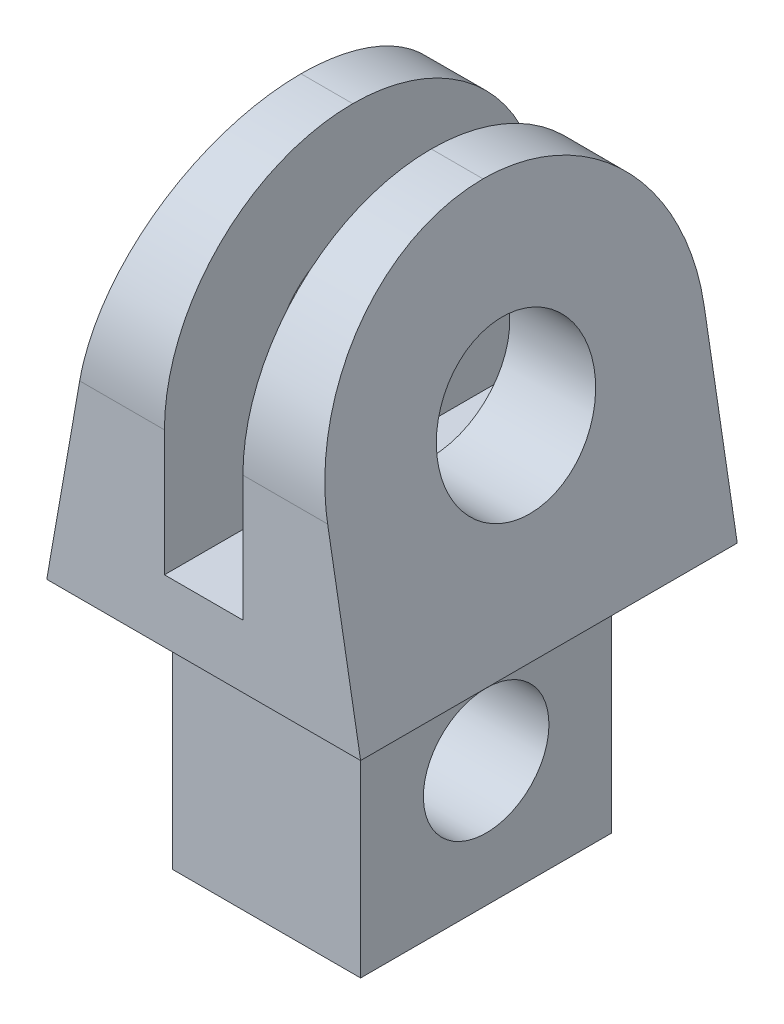
ISO-10303-21;
HEADER;
FILE_DESCRIPTION(('STEP AP214'),'2;1');
FILE_NAME('part.step','',(''),(''),'','','');
FILE_SCHEMA(('AUTOMOTIVE_DESIGN { 1 0 10303 214 1 1 1 1 }'));
ENDSEC;
DATA;
#1=APPLICATION_CONTEXT('core data for automotive mechanical design processes');
#2=APPLICATION_PROTOCOL_DEFINITION('international standard','automotive_design',2000,#1);
#3=PRODUCT_CONTEXT('',#1,'mechanical');
#4=PRODUCT('Part','Part','',(#3));
#5=PRODUCT_RELATED_PRODUCT_CATEGORY('part','',(#4));
#6=PRODUCT_DEFINITION_FORMATION('','',#4);
#7=PRODUCT_DEFINITION_CONTEXT('part definition',#1,'design');
#8=PRODUCT_DEFINITION('design','',#6,#7);
#9=PRODUCT_DEFINITION_SHAPE('','',#8);
#10=(LENGTH_UNIT() NAMED_UNIT(*) SI_UNIT(.MILLI.,.METRE.));
#11=(NAMED_UNIT(*) PLANE_ANGLE_UNIT() SI_UNIT($,.RADIAN.));
#12=(NAMED_UNIT(*) SI_UNIT($,.STERADIAN.) SOLID_ANGLE_UNIT());
#13=UNCERTAINTY_MEASURE_WITH_UNIT(LENGTH_MEASURE(1.E-05),#10,'distance_accuracy_value','');
#14=(GEOMETRIC_REPRESENTATION_CONTEXT(3) GLOBAL_UNCERTAINTY_ASSIGNED_CONTEXT((#13)) GLOBAL_UNIT_ASSIGNED_CONTEXT((#10,
#11,#12)) REPRESENTATION_CONTEXT('',''));
#15=CARTESIAN_POINT('',(0.,0.,0.));
#16=DIRECTION('',(0.,0.,1.));
#17=DIRECTION('',(1.,0.,0.));
#18=AXIS2_PLACEMENT_3D('',#15,#16,#17);
#19=CARTESIAN_POINT('',(-30.,0.,40.));
#20=DIRECTION('',(1.,0.,0.));
#21=DIRECTION('',(0.,1.,0.));
#22=AXIS2_PLACEMENT_3D('',#19,#20,#21);
#23=PLANE('',#22);
#24=CARTESIAN_POINT('',(-30.,-60.,0.));
#25=DIRECTION('',(1.,0.,0.));
#26=DIRECTION('',(0.,1.,0.));
#27=AXIS2_PLACEMENT_3D('',#24,#25,#26);
#28=CIRCLE('',#27,20.);
#29=CARTESIAN_POINT('',(-30.,-40.,0.));
#30=VERTEX_POINT('',#29);
#31=EDGE_CURVE('E255',#30,#30,#28,.T.);
#32=ORIENTED_EDGE('',*,*,#31,.T.);
#33=EDGE_LOOP('',(#32));
#34=FACE_BOUND('',#33,.T.);
#35=DIRECTION('',(0.,-1.,0.));
#36=VECTOR('',#35,1.);
#37=CARTESIAN_POINT('',(-30.,0.,-40.));
#38=LINE('',#37,#36);
#39=CARTESIAN_POINT('',(-30.,-20.,-40.));
#40=VERTEX_POINT('',#39);
#41=CARTESIAN_POINT('',(-30.,-100.,-40.));
#42=VERTEX_POINT('',#41);
#43=EDGE_CURVE('E149',#40,#42,#38,.T.);
#44=ORIENTED_EDGE('',*,*,#43,.T.);
#45=DIRECTION('',(0.,0.,-1.));
#46=VECTOR('',#45,1.);
#47=CARTESIAN_POINT('',(-30.,-100.,40.));
#48=LINE('',#47,#46);
#49=CARTESIAN_POINT('',(-30.,-100.,40.));
#50=VERTEX_POINT('',#49);
#51=EDGE_CURVE('E219',#50,#42,#48,.T.);
#52=ORIENTED_EDGE('',*,*,#51,.F.);
#53=DIRECTION('',(0.,-1.,0.));
#54=VECTOR('',#53,1.);
#55=CARTESIAN_POINT('',(-30.,0.,40.));
#56=LINE('',#55,#54);
#57=CARTESIAN_POINT('',(-30.,-20.,40.));
#58=VERTEX_POINT('',#57);
#59=EDGE_CURVE('E191',#58,#50,#56,.T.);
#60=ORIENTED_EDGE('',*,*,#59,.F.);
#61=DIRECTION('',(0.,0.,-1.));
#62=VECTOR('',#61,1.);
#63=CARTESIAN_POINT('',(-30.,-20.,40.));
#64=LINE('',#63,#62);
#65=EDGE_CURVE('E203',#58,#40,#64,.T.);
#66=ORIENTED_EDGE('',*,*,#65,.T.);
#67=EDGE_LOOP('',(#44,#52,#60,#66));
#68=FACE_BOUND('',#67,.T.);
#69=ADVANCED_FACE('F39',(#34,#68),#23,.F.);
#70=CARTESIAN_POINT('',(0.,-100.,40.));
#71=DIRECTION('',(0.,1.,0.));
#72=DIRECTION('',(0.,0.,1.));
#73=AXIS2_PLACEMENT_3D('',#70,#71,#72);
#74=PLANE('',#73);
#75=DIRECTION('',(1.,0.,0.));
#76=VECTOR('',#75,1.);
#77=CARTESIAN_POINT('',(0.,-100.,-40.));
#78=LINE('',#77,#76);
#79=CARTESIAN_POINT('',(30.,-100.,-40.));
#80=VERTEX_POINT('',#79);
#81=EDGE_CURVE('E206',#42,#80,#78,.T.);
#82=ORIENTED_EDGE('',*,*,#81,.T.);
#83=DIRECTION('',(0.,0.,-1.));
#84=VECTOR('',#83,1.);
#85=CARTESIAN_POINT('',(30.,-100.,40.));
#86=LINE('',#85,#84);
#87=CARTESIAN_POINT('',(30.,-100.,40.));
#88=VERTEX_POINT('',#87);
#89=EDGE_CURVE('E217',#88,#80,#86,.T.);
#90=ORIENTED_EDGE('',*,*,#89,.F.);
#91=DIRECTION('',(1.,0.,0.));
#92=VECTOR('',#91,1.);
#93=CARTESIAN_POINT('',(0.,-100.,40.));
#94=LINE('',#93,#92);
#95=EDGE_CURVE('E194',#50,#88,#94,.T.);
#96=ORIENTED_EDGE('',*,*,#95,.F.);
#97=ORIENTED_EDGE('',*,*,#51,.T.);
#98=EDGE_LOOP('',(#82,#90,#96,#97));
#99=FACE_BOUND('',#98,.T.);
#100=ADVANCED_FACE('F311',(#99),#74,.F.);
#101=CARTESIAN_POINT('',(30.,0.,40.));
#102=DIRECTION('',(1.,0.,0.));
#103=DIRECTION('',(0.,1.,0.));
#104=AXIS2_PLACEMENT_3D('',#101,#102,#103);
#105=PLANE('',#104);
#106=CARTESIAN_POINT('',(30.,-60.,0.));
#107=DIRECTION('',(1.,0.,0.));
#108=DIRECTION('',(0.,1.,0.));
#109=AXIS2_PLACEMENT_3D('',#106,#107,#108);
#110=CIRCLE('',#109,20.);
#111=CARTESIAN_POINT('',(30.,-40.,0.));
#112=VERTEX_POINT('',#111);
#113=EDGE_CURVE('E43',#112,#112,#110,.T.);
#114=ORIENTED_EDGE('',*,*,#113,.F.);
#115=EDGE_LOOP('',(#114));
#116=FACE_BOUND('',#115,.T.);
#117=DIRECTION('',(0.,-1.,0.));
#118=VECTOR('',#117,1.);
#119=CARTESIAN_POINT('',(30.,0.,-40.));
#120=LINE('',#119,#118);
#121=CARTESIAN_POINT('',(30.,-20.,-40.));
#122=VERTEX_POINT('',#121);
#123=EDGE_CURVE('E209',#122,#80,#120,.T.);
#124=ORIENTED_EDGE('',*,*,#123,.F.);
#125=DIRECTION('',(0.,0.,-1.));
#126=VECTOR('',#125,1.);
#127=CARTESIAN_POINT('',(30.,-20.,40.));
#128=LINE('',#127,#126);
#129=CARTESIAN_POINT('',(30.,-20.,40.));
#130=VERTEX_POINT('',#129);
#131=EDGE_CURVE('E214',#130,#122,#128,.T.);
#132=ORIENTED_EDGE('',*,*,#131,.F.);
#133=DIRECTION('',(0.,-1.,0.));
#134=VECTOR('',#133,1.);
#135=CARTESIAN_POINT('',(30.,0.,40.));
#136=LINE('',#135,#134);
#137=EDGE_CURVE('E197',#130,#88,#136,.T.);
#138=ORIENTED_EDGE('',*,*,#137,.T.);
#139=ORIENTED_EDGE('',*,*,#89,.T.);
#140=EDGE_LOOP('',(#124,#132,#138,#139));
#141=FACE_BOUND('',#140,.T.);
#142=ADVANCED_FACE('F317',(#116,#141),#105,.T.);
#143=CARTESIAN_POINT('',(0.,0.,40.));
#144=DIRECTION('',(0.,0.,1.));
#145=DIRECTION('',(1.,0.,0.));
#146=AXIS2_PLACEMENT_3D('',#143,#144,#145);
#147=PLANE('',#146);
#148=ORIENTED_EDGE('',*,*,#59,.T.);
#149=ORIENTED_EDGE('',*,*,#95,.T.);
#150=ORIENTED_EDGE('',*,*,#137,.F.);
#151=DIRECTION('',(1.,0.,0.));
#152=VECTOR('',#151,1.);
#153=CARTESIAN_POINT('',(0.,-20.,40.));
#154=LINE('',#153,#152);
#155=EDGE_CURVE('E200',#58,#130,#154,.T.);
#156=ORIENTED_EDGE('',*,*,#155,.F.);
#157=EDGE_LOOP('',(#148,#149,#150,#156));
#158=FACE_BOUND('',#157,.T.);
#159=ADVANCED_FACE('F323',(#158),#147,.T.);
#160=CARTESIAN_POINT('',(0.,0.,-40.));
#161=DIRECTION('',(0.,0.,1.));
#162=DIRECTION('',(1.,0.,0.));
#163=AXIS2_PLACEMENT_3D('',#160,#161,#162);
#164=PLANE('',#163);
#165=ORIENTED_EDGE('',*,*,#43,.F.);
#166=DIRECTION('',(1.,0.,0.));
#167=VECTOR('',#166,1.);
#168=CARTESIAN_POINT('',(0.,-20.,-40.));
#169=LINE('',#168,#167);
#170=EDGE_CURVE('E195',#40,#122,#169,.T.);
#171=ORIENTED_EDGE('',*,*,#170,.T.);
#172=ORIENTED_EDGE('',*,*,#123,.T.);
#173=ORIENTED_EDGE('',*,*,#81,.F.);
#174=EDGE_LOOP('',(#165,#171,#172,#173));
#175=FACE_BOUND('',#174,.T.);
#176=ADVANCED_FACE('F325',(#175),#164,.F.);
#177=CARTESIAN_POINT('',(45.1182534869618,7.89569436021831,60.));
#178=DIRECTION('',(0.985030467155704,0.172380331752248,0.));
#179=DIRECTION('',(-0.172380331752248,0.985030467155704,0.));
#180=AXIS2_PLACEMENT_3D('',#177,#178,#179);
#181=PLANE('',#180);
#182=CARTESIAN_POINT('',(39.5,40.,0.));
#183=DIRECTION('',(0.985030467155704,0.172380331752248,0.));
#184=DIRECTION('',(0.172380331752248,-0.985030467155704,0.));
#185=AXIS2_PLACEMENT_3D('',#182,#183,#184);
#186=ELLIPSE('',#185,25.3799256303087,25.);
#187=CARTESIAN_POINT('',(43.875,15.,0.));
#188=VERTEX_POINT('',#187);
#189=EDGE_CURVE('E173',#188,#188,#186,.T.);
#190=ORIENTED_EDGE('',*,*,#189,.F.);
#191=EDGE_LOOP('',(#190));
#192=FACE_BOUND('',#191,.T.);
#193=DIRECTION('',(0.172380331752248,-0.985030467155704,0.));
#194=VECTOR('',#193,1.);
#195=CARTESIAN_POINT('',(45.1182534869618,7.89569436021831,-60.));
#196=LINE('',#195,#194);
#197=CARTESIAN_POINT('',(39.5,40.,-60.));
#198=VERTEX_POINT('',#197);
#199=CARTESIAN_POINT('',(50.,-20.,-60.));
#200=VERTEX_POINT('',#199);
#201=EDGE_CURVE('E171',#198,#200,#196,.T.);
#202=ORIENTED_EDGE('',*,*,#201,.F.);
#203=CARTESIAN_POINT('',(39.5,40.,0.));
#204=DIRECTION('',(0.985030467155704,0.172380331752248,0.));
#205=DIRECTION('',(-0.172380331752248,0.985030467155704,0.));
#206=AXIS2_PLACEMENT_3D('',#203,#204,#205);
#207=ELLIPSE('',#206,60.9118215127409,60.);
#208=CARTESIAN_POINT('',(29.,100.,0.));
#209=VERTEX_POINT('',#208);
#210=EDGE_CURVE('E243',#198,#209,#207,.T.);
#211=ORIENTED_EDGE('',*,*,#210,.T.);
#212=CARTESIAN_POINT('',(39.5,40.,0.));
#213=DIRECTION('',(0.985030467155704,0.172380331752248,0.));
#214=DIRECTION('',(0.172380331752248,-0.985030467155704,0.));
#215=AXIS2_PLACEMENT_3D('',#212,#213,#214);
#216=ELLIPSE('',#215,60.9118215127409,60.);
#217=CARTESIAN_POINT('',(39.5,40.,60.));
#218=VERTEX_POINT('',#217);
#219=EDGE_CURVE('E241',#209,#218,#216,.T.);
#220=ORIENTED_EDGE('',*,*,#219,.T.);
#221=DIRECTION('',(0.172380331752248,-0.985030467155704,0.));
#222=VECTOR('',#221,1.);
#223=CARTESIAN_POINT('',(45.1182534869618,7.89569436021831,60.));
#224=LINE('',#223,#222);
#225=CARTESIAN_POINT('',(50.,-20.,60.));
#226=VERTEX_POINT('',#225);
#227=EDGE_CURVE('E156',#218,#226,#224,.T.);
#228=ORIENTED_EDGE('',*,*,#227,.T.);
#229=DIRECTION('',(0.,0.,-1.));
#230=VECTOR('',#229,1.);
#231=CARTESIAN_POINT('',(50.,-20.,60.));
#232=LINE('',#231,#230);
#233=EDGE_CURVE('E170',#226,#200,#232,.T.);
#234=ORIENTED_EDGE('',*,*,#233,.T.);
#235=EDGE_LOOP('',(#202,#211,#220,#228,#234));
#236=FACE_BOUND('',#235,.T.);
#237=ADVANCED_FACE('F271',(#192,#236),#181,.T.);
#238=CARTESIAN_POINT('',(12.5,0.,60.));
#239=DIRECTION('',(-1.,0.,0.));
#240=DIRECTION('',(0.,0.,1.));
#241=AXIS2_PLACEMENT_3D('',#238,#239,#240);
#242=PLANE('',#241);
#243=CARTESIAN_POINT('',(12.5,40.,0.));
#244=DIRECTION('',(-1.,0.,0.));
#245=DIRECTION('',(0.,0.,1.));
#246=AXIS2_PLACEMENT_3D('',#243,#244,#245);
#247=CIRCLE('',#246,25.);
#248=CARTESIAN_POINT('',(12.5,40.,25.));
#249=VERTEX_POINT('',#248);
#250=EDGE_CURVE('E265',#249,#249,#247,.T.);
#251=ORIENTED_EDGE('',*,*,#250,.F.);
#252=EDGE_LOOP('',(#251));
#253=FACE_BOUND('',#252,.T.);
#254=CARTESIAN_POINT('',(12.5,40.,0.));
#255=DIRECTION('',(-1.,0.,0.));
#256=DIRECTION('',(0.,0.,1.));
#257=AXIS2_PLACEMENT_3D('',#254,#255,#256);
#258=CIRCLE('',#257,60.);
#259=CARTESIAN_POINT('',(12.5,40.,60.));
#260=VERTEX_POINT('',#259);
#261=CARTESIAN_POINT('',(12.5,100.,0.));
#262=VERTEX_POINT('',#261);
#263=EDGE_CURVE('E56',#260,#262,#258,.T.);
#264=ORIENTED_EDGE('',*,*,#263,.T.);
#265=CARTESIAN_POINT('',(12.5,40.,0.));
#266=DIRECTION('',(-1.,0.,0.));
#267=DIRECTION('',(0.,0.,1.));
#268=AXIS2_PLACEMENT_3D('',#265,#266,#267);
#269=CIRCLE('',#268,60.);
#270=CARTESIAN_POINT('',(12.5,40.,-60.));
#271=VERTEX_POINT('',#270);
#272=EDGE_CURVE('E246',#262,#271,#269,.T.);
#273=ORIENTED_EDGE('',*,*,#272,.T.);
#274=DIRECTION('',(0.,1.,0.));
#275=VECTOR('',#274,1.);
#276=CARTESIAN_POINT('',(12.5,0.,-60.));
#277=LINE('',#276,#275);
#278=CARTESIAN_POINT('',(12.5,0.,-60.));
#279=VERTEX_POINT('',#278);
#280=EDGE_CURVE('E144',#279,#271,#277,.T.);
#281=ORIENTED_EDGE('',*,*,#280,.F.);
#282=DIRECTION('',(0.,0.,-1.));
#283=VECTOR('',#282,1.);
#284=CARTESIAN_POINT('',(12.5,0.,60.));
#285=LINE('',#284,#283);
#286=CARTESIAN_POINT('',(12.5,0.,60.));
#287=VERTEX_POINT('',#286);
#288=EDGE_CURVE('E140',#287,#279,#285,.T.);
#289=ORIENTED_EDGE('',*,*,#288,.F.);
#290=DIRECTION('',(0.,1.,0.));
#291=VECTOR('',#290,1.);
#292=CARTESIAN_POINT('',(12.5,0.,60.));
#293=LINE('',#292,#291);
#294=EDGE_CURVE('E142',#287,#260,#293,.T.);
#295=ORIENTED_EDGE('',*,*,#294,.T.);
#296=EDGE_LOOP('',(#264,#273,#281,#289,#295));
#297=FACE_BOUND('',#296,.T.);
#298=ADVANCED_FACE('F141',(#253,#297),#242,.T.);
#299=CARTESIAN_POINT('',(0.,0.,60.));
#300=DIRECTION('',(0.,1.,0.));
#301=DIRECTION('',(0.,0.,1.));
#302=AXIS2_PLACEMENT_3D('',#299,#300,#301);
#303=PLANE('',#302);
#304=DIRECTION('',(1.,0.,0.));
#305=VECTOR('',#304,1.);
#306=CARTESIAN_POINT('',(0.,0.,-60.));
#307=LINE('',#306,#305);
#308=CARTESIAN_POINT('',(-12.5,0.,-60.));
#309=VERTEX_POINT('',#308);
#310=EDGE_CURVE('E175',#309,#279,#307,.T.);
#311=ORIENTED_EDGE('',*,*,#310,.F.);
#312=DIRECTION('',(0.,0.,-1.));
#313=VECTOR('',#312,1.);
#314=CARTESIAN_POINT('',(-12.5,0.,60.));
#315=LINE('',#314,#313);
#316=CARTESIAN_POINT('',(-12.5,0.,60.));
#317=VERTEX_POINT('',#316);
#318=EDGE_CURVE('E150',#317,#309,#315,.T.);
#319=ORIENTED_EDGE('',*,*,#318,.F.);
#320=DIRECTION('',(1.,0.,0.));
#321=VECTOR('',#320,1.);
#322=CARTESIAN_POINT('',(0.,0.,60.));
#323=LINE('',#322,#321);
#324=EDGE_CURVE('E155',#317,#287,#323,.T.);
#325=ORIENTED_EDGE('',*,*,#324,.T.);
#326=ORIENTED_EDGE('',*,*,#288,.T.);
#327=EDGE_LOOP('',(#311,#319,#325,#326));
#328=FACE_BOUND('',#327,.T.);
#329=ADVANCED_FACE('F158',(#328),#303,.T.);
#330=CARTESIAN_POINT('',(-12.5,0.,60.));
#331=DIRECTION('',(-1.,0.,0.));
#332=DIRECTION('',(0.,0.,1.));
#333=AXIS2_PLACEMENT_3D('',#330,#331,#332);
#334=PLANE('',#333);
#335=CARTESIAN_POINT('',(-12.5,40.,0.));
#336=DIRECTION('',(-1.,0.,0.));
#337=DIRECTION('',(0.,0.,1.));
#338=AXIS2_PLACEMENT_3D('',#335,#336,#337);
#339=CIRCLE('',#338,25.);
#340=CARTESIAN_POINT('',(-12.5,40.,25.));
#341=VERTEX_POINT('',#340);
#342=EDGE_CURVE('E226',#341,#341,#339,.T.);
#343=ORIENTED_EDGE('',*,*,#342,.T.);
#344=EDGE_LOOP('',(#343));
#345=FACE_BOUND('',#344,.T.);
#346=DIRECTION('',(0.,1.,0.));
#347=VECTOR('',#346,1.);
#348=CARTESIAN_POINT('',(-12.5,0.,-60.));
#349=LINE('',#348,#347);
#350=CARTESIAN_POINT('',(-12.5,40.,-60.));
#351=VERTEX_POINT('',#350);
#352=EDGE_CURVE('E177',#309,#351,#349,.T.);
#353=ORIENTED_EDGE('',*,*,#352,.T.);
#354=CARTESIAN_POINT('',(-12.5,40.,0.));
#355=DIRECTION('',(-1.,0.,0.));
#356=DIRECTION('',(0.,0.,1.));
#357=AXIS2_PLACEMENT_3D('',#354,#355,#356);
#358=CIRCLE('',#357,60.);
#359=CARTESIAN_POINT('',(-12.5,100.,0.));
#360=VERTEX_POINT('',#359);
#361=EDGE_CURVE('E239',#351,#360,#358,.F.);
#362=ORIENTED_EDGE('',*,*,#361,.T.);
#363=CARTESIAN_POINT('',(-12.5,40.,0.));
#364=DIRECTION('',(-1.,0.,0.));
#365=DIRECTION('',(0.,0.,1.));
#366=AXIS2_PLACEMENT_3D('',#363,#364,#365);
#367=CIRCLE('',#366,60.);
#368=CARTESIAN_POINT('',(-12.5,40.,60.));
#369=VERTEX_POINT('',#368);
#370=EDGE_CURVE('E237',#360,#369,#367,.F.);
#371=ORIENTED_EDGE('',*,*,#370,.T.);
#372=DIRECTION('',(0.,1.,0.));
#373=VECTOR('',#372,1.);
#374=CARTESIAN_POINT('',(-12.5,0.,60.));
#375=LINE('',#374,#373);
#376=EDGE_CURVE('E160',#317,#369,#375,.T.);
#377=ORIENTED_EDGE('',*,*,#376,.F.);
#378=ORIENTED_EDGE('',*,*,#318,.T.);
#379=EDGE_LOOP('',(#353,#362,#371,#377,#378));
#380=FACE_BOUND('',#379,.T.);
#381=ADVANCED_FACE('F289',(#345,#380),#334,.F.);
#382=CARTESIAN_POINT('',(-45.1182534869618,7.89569436021831,60.));
#383=DIRECTION('',(0.985030467155704,-0.172380331752248,0.));
#384=DIRECTION('',(0.172380331752248,0.985030467155704,0.));
#385=AXIS2_PLACEMENT_3D('',#382,#383,#384);
#386=PLANE('',#385);
#387=CARTESIAN_POINT('',(-39.5,40.,0.));
#388=DIRECTION('',(0.985030467155704,-0.172380331752248,0.));
#389=DIRECTION('',(0.172380331752248,0.985030467155704,0.));
#390=AXIS2_PLACEMENT_3D('',#387,#388,#389);
#391=ELLIPSE('',#390,25.3799256303087,25.);
#392=CARTESIAN_POINT('',(-35.125,65.,0.));
#393=VERTEX_POINT('',#392);
#394=EDGE_CURVE('E223',#393,#393,#391,.T.);
#395=ORIENTED_EDGE('',*,*,#394,.T.);
#396=EDGE_LOOP('',(#395));
#397=FACE_BOUND('',#396,.T.);
#398=CARTESIAN_POINT('',(-39.5,40.,0.));
#399=DIRECTION('',(0.985030467155704,-0.172380331752248,0.));
#400=DIRECTION('',(0.172380331752248,0.985030467155704,0.));
#401=AXIS2_PLACEMENT_3D('',#398,#399,#400);
#402=ELLIPSE('',#401,60.9118215127409,60.);
#403=CARTESIAN_POINT('',(-39.5,40.,60.));
#404=VERTEX_POINT('',#403);
#405=CARTESIAN_POINT('',(-29.,100.,0.));
#406=VERTEX_POINT('',#405);
#407=EDGE_CURVE('E222',#404,#406,#402,.F.);
#408=ORIENTED_EDGE('',*,*,#407,.T.);
#409=CARTESIAN_POINT('',(-39.5,40.,0.));
#410=DIRECTION('',(0.985030467155704,-0.172380331752248,0.));
#411=DIRECTION('',(-0.172380331752248,-0.985030467155704,0.));
#412=AXIS2_PLACEMENT_3D('',#409,#410,#411);
#413=ELLIPSE('',#412,60.9118215127409,60.);
#414=CARTESIAN_POINT('',(-39.5,40.,-60.));
#415=VERTEX_POINT('',#414);
#416=EDGE_CURVE('E229',#406,#415,#413,.F.);
#417=ORIENTED_EDGE('',*,*,#416,.T.);
#418=DIRECTION('',(-0.172380331752248,-0.985030467155704,0.));
#419=VECTOR('',#418,1.);
#420=CARTESIAN_POINT('',(-45.1182534869618,7.89569436021831,-60.));
#421=LINE('',#420,#419);
#422=CARTESIAN_POINT('',(-50.,-20.,-60.));
#423=VERTEX_POINT('',#422);
#424=EDGE_CURVE('E180',#415,#423,#421,.T.);
#425=ORIENTED_EDGE('',*,*,#424,.T.);
#426=DIRECTION('',(0.,0.,-1.));
#427=VECTOR('',#426,1.);
#428=CARTESIAN_POINT('',(-50.,-20.,60.));
#429=LINE('',#428,#427);
#430=CARTESIAN_POINT('',(-50.,-20.,60.));
#431=VERTEX_POINT('',#430);
#432=EDGE_CURVE('E187',#431,#423,#429,.T.);
#433=ORIENTED_EDGE('',*,*,#432,.F.);
#434=DIRECTION('',(-0.172380331752248,-0.985030467155704,0.));
#435=VECTOR('',#434,1.);
#436=CARTESIAN_POINT('',(-45.1182534869618,7.89569436021831,60.));
#437=LINE('',#436,#435);
#438=EDGE_CURVE('E162',#404,#431,#437,.T.);
#439=ORIENTED_EDGE('',*,*,#438,.F.);
#440=EDGE_LOOP('',(#408,#417,#425,#433,#439));
#441=FACE_BOUND('',#440,.T.);
#442=ADVANCED_FACE('F298',(#397,#441),#386,.F.);
#443=CARTESIAN_POINT('',(0.,-20.,60.));
#444=DIRECTION('',(0.,1.,0.));
#445=DIRECTION('',(0.,0.,1.));
#446=AXIS2_PLACEMENT_3D('',#443,#444,#445);
#447=PLANE('',#446);
#448=ORIENTED_EDGE('',*,*,#170,.F.);
#449=ORIENTED_EDGE('',*,*,#65,.F.);
#450=ORIENTED_EDGE('',*,*,#155,.T.);
#451=ORIENTED_EDGE('',*,*,#131,.T.);
#452=EDGE_LOOP('',(#448,#449,#450,#451));
#453=FACE_BOUND('',#452,.T.);
#454=DIRECTION('',(1.,0.,0.));
#455=VECTOR('',#454,1.);
#456=CARTESIAN_POINT('',(0.,-20.,-60.));
#457=LINE('',#456,#455);
#458=EDGE_CURVE('E182',#423,#200,#457,.T.);
#459=ORIENTED_EDGE('',*,*,#458,.T.);
#460=ORIENTED_EDGE('',*,*,#233,.F.);
#461=DIRECTION('',(1.,0.,0.));
#462=VECTOR('',#461,1.);
#463=CARTESIAN_POINT('',(0.,-20.,60.));
#464=LINE('',#463,#462);
#465=EDGE_CURVE('E167',#431,#226,#464,.T.);
#466=ORIENTED_EDGE('',*,*,#465,.F.);
#467=ORIENTED_EDGE('',*,*,#432,.T.);
#468=EDGE_LOOP('',(#459,#460,#466,#467));
#469=FACE_BOUND('',#468,.T.);
#470=ADVANCED_FACE('F278',(#453,#469),#447,.F.);
#471=CARTESIAN_POINT('',(0.,0.,60.));
#472=DIRECTION('',(0.,0.,1.));
#473=DIRECTION('',(1.,0.,0.));
#474=AXIS2_PLACEMENT_3D('',#471,#472,#473);
#475=PLANE('',#474);
#476=ORIENTED_EDGE('',*,*,#376,.T.);
#477=DIRECTION('',(-1.,0.,0.));
#478=VECTOR('',#477,1.);
#479=CARTESIAN_POINT('',(-29.,40.,60.));
#480=LINE('',#479,#478);
#481=EDGE_CURVE('E11',#369,#404,#480,.T.);
#482=ORIENTED_EDGE('',*,*,#481,.T.);
#483=ORIENTED_EDGE('',*,*,#438,.T.);
#484=ORIENTED_EDGE('',*,*,#465,.T.);
#485=ORIENTED_EDGE('',*,*,#227,.F.);
#486=DIRECTION('',(1.,0.,0.));
#487=VECTOR('',#486,1.);
#488=CARTESIAN_POINT('',(0.,40.,60.));
#489=LINE('',#488,#487);
#490=EDGE_CURVE('E48',#218,#260,#489,.F.);
#491=ORIENTED_EDGE('',*,*,#490,.T.);
#492=ORIENTED_EDGE('',*,*,#294,.F.);
#493=ORIENTED_EDGE('',*,*,#324,.F.);
#494=EDGE_LOOP('',(#476,#482,#483,#484,#485,#491,#492,#493));
#495=FACE_BOUND('',#494,.T.);
#496=ADVANCED_FACE('F154',(#495),#475,.T.);
#497=CARTESIAN_POINT('',(0.,0.,-60.));
#498=DIRECTION('',(0.,0.,1.));
#499=DIRECTION('',(1.,0.,0.));
#500=AXIS2_PLACEMENT_3D('',#497,#498,#499);
#501=PLANE('',#500);
#502=ORIENTED_EDGE('',*,*,#424,.F.);
#503=DIRECTION('',(-1.,0.,0.));
#504=VECTOR('',#503,1.);
#505=CARTESIAN_POINT('',(0.,40.,-60.));
#506=LINE('',#505,#504);
#507=EDGE_CURVE('E234',#415,#351,#506,.F.);
#508=ORIENTED_EDGE('',*,*,#507,.T.);
#509=ORIENTED_EDGE('',*,*,#352,.F.);
#510=ORIENTED_EDGE('',*,*,#310,.T.);
#511=ORIENTED_EDGE('',*,*,#280,.T.);
#512=DIRECTION('',(1.,0.,0.));
#513=VECTOR('',#512,1.);
#514=CARTESIAN_POINT('',(29.,40.,-60.));
#515=LINE('',#514,#513);
#516=EDGE_CURVE('E231',#271,#198,#515,.T.);
#517=ORIENTED_EDGE('',*,*,#516,.T.);
#518=ORIENTED_EDGE('',*,*,#201,.T.);
#519=ORIENTED_EDGE('',*,*,#458,.F.);
#520=EDGE_LOOP('',(#502,#508,#509,#510,#511,#517,#518,#519));
#521=FACE_BOUND('',#520,.T.);
#522=ADVANCED_FACE('F282',(#521),#501,.F.);
#523=CARTESIAN_POINT('',(-60.,40.,0.));
#524=DIRECTION('',(1.,0.,0.));
#525=DIRECTION('',(0.,0.,-1.));
#526=AXIS2_PLACEMENT_3D('',#523,#524,#525);
#527=CYLINDRICAL_SURFACE('',#526,25.);
#528=ORIENTED_EDGE('',*,*,#394,.F.);
#529=EDGE_LOOP('',(#528));
#530=FACE_BOUND('',#529,.T.);
#531=ORIENTED_EDGE('',*,*,#342,.F.);
#532=EDGE_LOOP('',(#531));
#533=FACE_BOUND('',#532,.T.);
#534=ADVANCED_FACE('F351',(#530,#533),#527,.F.);
#535=ORIENTED_EDGE('',*,*,#189,.T.);
#536=EDGE_LOOP('',(#535));
#537=FACE_BOUND('',#536,.T.);
#538=ORIENTED_EDGE('',*,*,#250,.T.);
#539=EDGE_LOOP('',(#538));
#540=FACE_BOUND('',#539,.T.);
#541=ADVANCED_FACE('F307',(#537,#540),#527,.F.);
#542=CARTESIAN_POINT('',(0.,40.,0.));
#543=DIRECTION('',(1.,0.,0.));
#544=DIRECTION('',(0.,0.,-1.));
#545=AXIS2_PLACEMENT_3D('',#542,#543,#544);
#546=CYLINDRICAL_SURFACE('',#545,60.);
#547=ORIENTED_EDGE('',*,*,#481,.F.);
#548=ORIENTED_EDGE('',*,*,#370,.F.);
#549=DIRECTION('',(-1.,0.,0.));
#550=VECTOR('',#549,1.);
#551=CARTESIAN_POINT('',(-12.5,100.,0.));
#552=LINE('',#551,#550);
#553=EDGE_CURVE('E227',#406,#360,#552,.F.);
#554=ORIENTED_EDGE('',*,*,#553,.F.);
#555=ORIENTED_EDGE('',*,*,#407,.F.);
#556=EDGE_LOOP('',(#547,#548,#554,#555));
#557=FACE_BOUND('',#556,.T.);
#558=ADVANCED_FACE('F294',(#557),#546,.T.);
#559=CARTESIAN_POINT('',(0.,40.,0.));
#560=DIRECTION('',(-1.,0.,0.));
#561=DIRECTION('',(0.,0.,1.));
#562=AXIS2_PLACEMENT_3D('',#559,#560,#561);
#563=CYLINDRICAL_SURFACE('',#562,60.);
#564=ORIENTED_EDGE('',*,*,#361,.F.);
#565=ORIENTED_EDGE('',*,*,#507,.F.);
#566=ORIENTED_EDGE('',*,*,#416,.F.);
#567=ORIENTED_EDGE('',*,*,#553,.T.);
#568=EDGE_LOOP('',(#564,#565,#566,#567));
#569=FACE_BOUND('',#568,.T.);
#570=ADVANCED_FACE('F300',(#569),#563,.T.);
#571=CARTESIAN_POINT('',(0.,40.,0.));
#572=DIRECTION('',(1.,0.,0.));
#573=DIRECTION('',(0.,0.,-1.));
#574=AXIS2_PLACEMENT_3D('',#571,#572,#573);
#575=CYLINDRICAL_SURFACE('',#574,60.);
#576=DIRECTION('',(1.,0.,0.));
#577=VECTOR('',#576,1.);
#578=CARTESIAN_POINT('',(0.,100.,0.));
#579=LINE('',#578,#577);
#580=EDGE_CURVE('E250',#262,#209,#579,.T.);
#581=ORIENTED_EDGE('',*,*,#580,.F.);
#582=ORIENTED_EDGE('',*,*,#263,.F.);
#583=ORIENTED_EDGE('',*,*,#490,.F.);
#584=ORIENTED_EDGE('',*,*,#219,.F.);
#585=EDGE_LOOP('',(#581,#582,#583,#584));
#586=FACE_BOUND('',#585,.T.);
#587=ADVANCED_FACE('F41',(#586),#575,.T.);
#588=CARTESIAN_POINT('',(0.,40.,0.));
#589=DIRECTION('',(-1.,0.,0.));
#590=DIRECTION('',(0.,0.,1.));
#591=AXIS2_PLACEMENT_3D('',#588,#589,#590);
#592=CYLINDRICAL_SURFACE('',#591,60.);
#593=ORIENTED_EDGE('',*,*,#272,.F.);
#594=ORIENTED_EDGE('',*,*,#580,.T.);
#595=ORIENTED_EDGE('',*,*,#210,.F.);
#596=ORIENTED_EDGE('',*,*,#516,.F.);
#597=EDGE_LOOP('',(#593,#594,#595,#596));
#598=FACE_BOUND('',#597,.T.);
#599=ADVANCED_FACE('F286',(#598),#592,.T.);
#600=CARTESIAN_POINT('',(-30.,-60.,0.));
#601=DIRECTION('',(1.,0.,0.));
#602=DIRECTION('',(0.,1.,0.));
#603=AXIS2_PLACEMENT_3D('',#600,#601,#602);
#604=CYLINDRICAL_SURFACE('',#603,20.);
#605=ORIENTED_EDGE('',*,*,#113,.T.);
#606=EDGE_LOOP('',(#605));
#607=FACE_BOUND('',#606,.T.);
#608=ORIENTED_EDGE('',*,*,#31,.F.);
#609=EDGE_LOOP('',(#608));
#610=FACE_BOUND('',#609,.T.);
#611=ADVANCED_FACE('F357',(#607,#610),#604,.F.);
#612=CLOSED_SHELL('',(#69,#100,#142,#159,#176,#237,#298,#329,#381,#442,#470,#496,#522,#534,#541,
#558,#570,#587,#599,#611));
#613=MANIFOLD_SOLID_BREP('B2',#612);
#614=ADVANCED_BREP_SHAPE_REPRESENTATION('',(#18,#613),#14);
#615=SHAPE_DEFINITION_REPRESENTATION(#9,#614);
ENDSEC;
END-ISO-10303-21;
